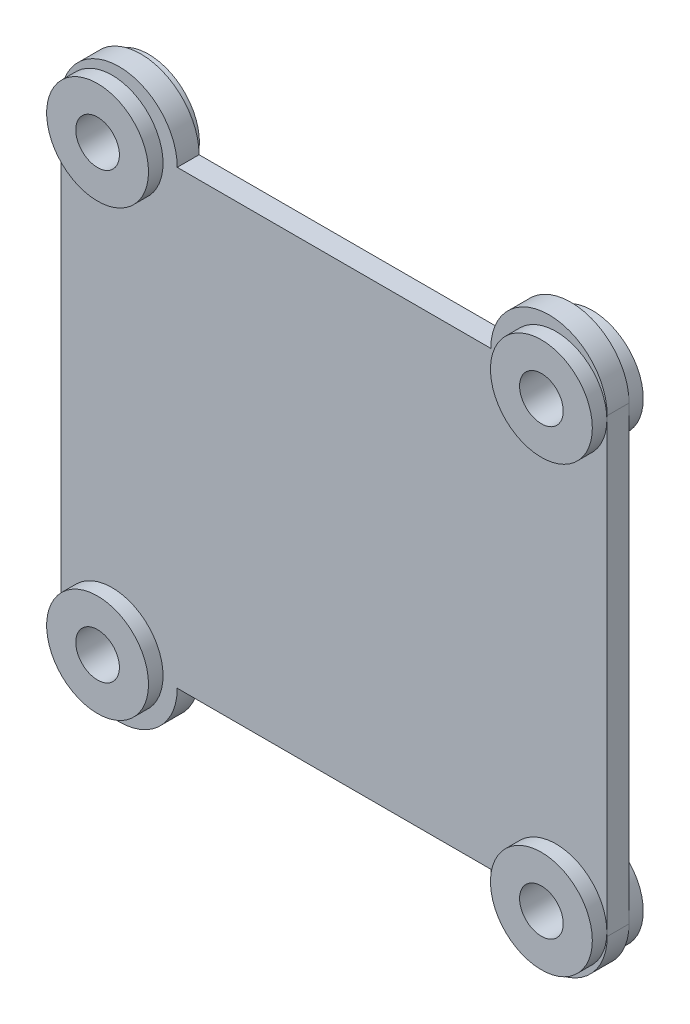
ISO-10303-21;
HEADER;
FILE_DESCRIPTION(('STEP AP214'),'2;1');
FILE_NAME('part.step','',(''),(''),'','','');
FILE_SCHEMA(('AUTOMOTIVE_DESIGN { 1 0 10303 214 1 1 1 1 }'));
ENDSEC;
DATA;
#1=APPLICATION_CONTEXT('core data for automotive mechanical design processes');
#2=APPLICATION_PROTOCOL_DEFINITION('international standard','automotive_design',2000,#1);
#3=PRODUCT_CONTEXT('',#1,'mechanical');
#4=PRODUCT('Part','Part','',(#3));
#5=PRODUCT_RELATED_PRODUCT_CATEGORY('part','',(#4));
#6=PRODUCT_DEFINITION_FORMATION('','',#4);
#7=PRODUCT_DEFINITION_CONTEXT('part definition',#1,'design');
#8=PRODUCT_DEFINITION('design','',#6,#7);
#9=PRODUCT_DEFINITION_SHAPE('','',#8);
#10=(LENGTH_UNIT() NAMED_UNIT(*) SI_UNIT(.MILLI.,.METRE.));
#11=(NAMED_UNIT(*) PLANE_ANGLE_UNIT() SI_UNIT($,.RADIAN.));
#12=(NAMED_UNIT(*) SI_UNIT($,.STERADIAN.) SOLID_ANGLE_UNIT());
#13=UNCERTAINTY_MEASURE_WITH_UNIT(LENGTH_MEASURE(1.E-05),#10,'distance_accuracy_value','');
#14=(GEOMETRIC_REPRESENTATION_CONTEXT(3) GLOBAL_UNCERTAINTY_ASSIGNED_CONTEXT((#13)) GLOBAL_UNIT_ASSIGNED_CONTEXT((#10,
#11,#12)) REPRESENTATION_CONTEXT('',''));
#15=CARTESIAN_POINT('',(0.,0.,0.));
#16=DIRECTION('',(0.,0.,1.));
#17=DIRECTION('',(1.,0.,0.));
#18=AXIS2_PLACEMENT_3D('',#15,#16,#17);
#19=CARTESIAN_POINT('',(13.8832261201287,-17.3040229885057,1.5));
#20=DIRECTION('',(0.,0.,-1.));
#21=DIRECTION('',(-1.,0.,0.));
#22=AXIS2_PLACEMENT_3D('',#19,#20,#21);
#23=PLANE('',#22);
#24=CARTESIAN_POINT('',(14.358226120129,13.4459770114943,1.5));
#25=DIRECTION('',(0.,0.,1.));
#26=DIRECTION('',(1.,0.,0.));
#27=AXIS2_PLACEMENT_3D('',#24,#25,#26);
#28=CIRCLE('',#27,3.5);
#29=CARTESIAN_POINT('',(17.858226120129,13.4459770114943,1.5));
#30=VERTEX_POINT('',#29);
#31=EDGE_CURVE('E283',#30,#30,#28,.T.);
#32=ORIENTED_EDGE('',*,*,#31,.F.);
#33=EDGE_LOOP('',(#32));
#34=FACE_BOUND('',#33,.T.);
#35=CARTESIAN_POINT('',(14.358226120129,-17.0540229885057,1.5));
#36=DIRECTION('',(0.,0.,1.));
#37=DIRECTION('',(1.,0.,0.));
#38=AXIS2_PLACEMENT_3D('',#35,#36,#37);
#39=CIRCLE('',#38,3.5);
#40=CARTESIAN_POINT('',(17.858226120129,-17.0540229885057,1.5));
#41=VERTEX_POINT('',#40);
#42=EDGE_CURVE('E299',#41,#41,#39,.T.);
#43=ORIENTED_EDGE('',*,*,#42,.F.);
#44=EDGE_LOOP('',(#43));
#45=FACE_BOUND('',#44,.T.);
#46=CARTESIAN_POINT('',(-16.141773879871,13.4459770114942,1.5));
#47=DIRECTION('',(0.,0.,1.));
#48=DIRECTION('',(1.,0.,0.));
#49=AXIS2_PLACEMENT_3D('',#46,#47,#48);
#50=CIRCLE('',#49,3.5);
#51=CARTESIAN_POINT('',(-12.641773879871,13.4459770114942,1.5));
#52=VERTEX_POINT('',#51);
#53=EDGE_CURVE('E314',#52,#52,#50,.T.);
#54=ORIENTED_EDGE('',*,*,#53,.F.);
#55=EDGE_LOOP('',(#54));
#56=FACE_BOUND('',#55,.T.);
#57=CARTESIAN_POINT('',(-16.141773879871,-17.0540229885057,1.5));
#58=DIRECTION('',(0.,0.,1.));
#59=DIRECTION('',(1.,0.,0.));
#60=AXIS2_PLACEMENT_3D('',#57,#58,#59);
#61=CIRCLE('',#60,3.5);
#62=CARTESIAN_POINT('',(-12.641773879871,-17.0540229885057,1.5));
#63=VERTEX_POINT('',#62);
#64=EDGE_CURVE('E329',#63,#63,#61,.T.);
#65=ORIENTED_EDGE('',*,*,#64,.F.);
#66=EDGE_LOOP('',(#65));
#67=FACE_BOUND('',#66,.T.);
#68=CARTESIAN_POINT('',(13.8832261201287,-17.3040229885057,1.5));
#69=DIRECTION('',(0.,0.,1.));
#70=DIRECTION('',(-1.,0.,0.));
#71=AXIS2_PLACEMENT_3D('',#68,#69,#70);
#72=CIRCLE('',#71,4.);
#73=CARTESIAN_POINT('',(9.88322612012868,-17.3040229885057,1.5));
#74=VERTEX_POINT('',#73);
#75=CARTESIAN_POINT('',(17.8832261201287,-17.3040229885057,1.5));
#76=VERTEX_POINT('',#75);
#77=EDGE_CURVE('E147',#74,#76,#72,.T.);
#78=ORIENTED_EDGE('',*,*,#77,.T.);
#79=DIRECTION('',(0.,1.,0.));
#80=VECTOR('',#79,1.);
#81=CARTESIAN_POINT('',(17.8832261201287,13.6959770114942,1.5));
#82=LINE('',#81,#80);
#83=CARTESIAN_POINT('',(17.8832261201287,13.6959770114942,1.5));
#84=VERTEX_POINT('',#83);
#85=EDGE_CURVE('E96',#76,#84,#82,.T.);
#86=ORIENTED_EDGE('',*,*,#85,.T.);
#87=CARTESIAN_POINT('',(13.8832261201287,13.6959770114942,1.5));
#88=DIRECTION('',(0.,0.,1.));
#89=DIRECTION('',(1.,0.,0.));
#90=AXIS2_PLACEMENT_3D('',#87,#88,#89);
#91=CIRCLE('',#90,4.);
#92=CARTESIAN_POINT('',(9.88322612012868,13.6959770114942,1.5));
#93=VERTEX_POINT('',#92);
#94=EDGE_CURVE('E345',#84,#93,#91,.T.);
#95=ORIENTED_EDGE('',*,*,#94,.T.);
#96=DIRECTION('',(-1.,0.,0.));
#97=VECTOR('',#96,1.);
#98=CARTESIAN_POINT('',(-11.6667738798713,13.6959770114942,1.5));
#99=LINE('',#98,#97);
#100=CARTESIAN_POINT('',(-11.6667738798713,13.6959770114942,1.5));
#101=VERTEX_POINT('',#100);
#102=EDGE_CURVE('E347',#93,#101,#99,.T.);
#103=ORIENTED_EDGE('',*,*,#102,.T.);
#104=CARTESIAN_POINT('',(-15.6667738798713,13.6959770114942,1.5));
#105=DIRECTION('',(0.,0.,1.));
#106=DIRECTION('',(1.,0.,0.));
#107=AXIS2_PLACEMENT_3D('',#104,#105,#106);
#108=CIRCLE('',#107,4.);
#109=CARTESIAN_POINT('',(-19.6667738798713,13.6959770114942,1.5));
#110=VERTEX_POINT('',#109);
#111=EDGE_CURVE('E114',#101,#110,#108,.T.);
#112=ORIENTED_EDGE('',*,*,#111,.T.);
#113=DIRECTION('',(0.,-1.,0.));
#114=VECTOR('',#113,1.);
#115=CARTESIAN_POINT('',(-19.6667738798713,13.6959770114942,1.5));
#116=LINE('',#115,#114);
#117=CARTESIAN_POINT('',(-19.6667738798713,-17.3040229885057,1.5));
#118=VERTEX_POINT('',#117);
#119=EDGE_CURVE('E109',#110,#118,#116,.T.);
#120=ORIENTED_EDGE('',*,*,#119,.T.);
#121=CARTESIAN_POINT('',(-15.6667738798713,-17.3040229885057,1.5));
#122=DIRECTION('',(0.,0.,1.));
#123=DIRECTION('',(-1.,0.,0.));
#124=AXIS2_PLACEMENT_3D('',#121,#122,#123);
#125=CIRCLE('',#124,4.);
#126=CARTESIAN_POINT('',(-11.6667738798713,-17.3040229885057,1.5));
#127=VERTEX_POINT('',#126);
#128=EDGE_CURVE('E112',#118,#127,#125,.T.);
#129=ORIENTED_EDGE('',*,*,#128,.T.);
#130=DIRECTION('',(1.,0.,0.));
#131=VECTOR('',#130,1.);
#132=CARTESIAN_POINT('',(-11.6667738798713,-17.3040229885057,1.5));
#133=LINE('',#132,#131);
#134=EDGE_CURVE('E52',#127,#74,#133,.T.);
#135=ORIENTED_EDGE('',*,*,#134,.T.);
#136=EDGE_LOOP('',(#78,#86,#95,#103,#112,#120,#129,#135));
#137=FACE_BOUND('',#136,.T.);
#138=ADVANCED_FACE('F35',(#34,#45,#56,#67,#137),#23,.F.);
#139=CARTESIAN_POINT('',(13.8832261201287,-17.3040229885057,0.));
#140=DIRECTION('',(0.,0.,-1.));
#141=DIRECTION('',(-1.,0.,0.));
#142=AXIS2_PLACEMENT_3D('',#139,#140,#141);
#143=PLANE('',#142);
#144=CARTESIAN_POINT('',(14.358226120129,13.4459770114943,0.));
#145=DIRECTION('',(0.,0.,-1.));
#146=DIRECTION('',(-1.,0.,0.));
#147=AXIS2_PLACEMENT_3D('',#144,#145,#146);
#148=CIRCLE('',#147,3.5);
#149=CARTESIAN_POINT('',(10.858226120129,13.4459770114943,0.));
#150=VERTEX_POINT('',#149);
#151=EDGE_CURVE('E11',#150,#150,#148,.T.);
#152=ORIENTED_EDGE('',*,*,#151,.F.);
#153=EDGE_LOOP('',(#152));
#154=FACE_BOUND('',#153,.T.);
#155=CARTESIAN_POINT('',(14.358226120129,-17.0540229885057,0.));
#156=DIRECTION('',(0.,0.,-1.));
#157=DIRECTION('',(-1.,0.,0.));
#158=AXIS2_PLACEMENT_3D('',#155,#156,#157);
#159=CIRCLE('',#158,3.5);
#160=CARTESIAN_POINT('',(10.858226120129,-17.0540229885057,0.));
#161=VERTEX_POINT('',#160);
#162=EDGE_CURVE('E44',#161,#161,#159,.T.);
#163=ORIENTED_EDGE('',*,*,#162,.F.);
#164=EDGE_LOOP('',(#163));
#165=FACE_BOUND('',#164,.T.);
#166=CARTESIAN_POINT('',(-16.141773879871,13.4459770114942,0.));
#167=DIRECTION('',(0.,0.,-1.));
#168=DIRECTION('',(-1.,0.,0.));
#169=AXIS2_PLACEMENT_3D('',#166,#167,#168);
#170=CIRCLE('',#169,3.5);
#171=CARTESIAN_POINT('',(-19.641773879871,13.4459770114942,0.));
#172=VERTEX_POINT('',#171);
#173=EDGE_CURVE('E165',#172,#172,#170,.T.);
#174=ORIENTED_EDGE('',*,*,#173,.F.);
#175=EDGE_LOOP('',(#174));
#176=FACE_BOUND('',#175,.T.);
#177=CARTESIAN_POINT('',(-16.141773879871,-17.0540229885057,0.));
#178=DIRECTION('',(0.,0.,-1.));
#179=DIRECTION('',(-1.,0.,0.));
#180=AXIS2_PLACEMENT_3D('',#177,#178,#179);
#181=CIRCLE('',#180,3.5);
#182=CARTESIAN_POINT('',(-19.641773879871,-17.0540229885057,0.));
#183=VERTEX_POINT('',#182);
#184=EDGE_CURVE('E162',#183,#183,#181,.T.);
#185=ORIENTED_EDGE('',*,*,#184,.F.);
#186=EDGE_LOOP('',(#185));
#187=FACE_BOUND('',#186,.T.);
#188=CARTESIAN_POINT('',(13.8832261201287,-17.3040229885057,0.));
#189=DIRECTION('',(0.,0.,1.));
#190=DIRECTION('',(-1.,0.,0.));
#191=AXIS2_PLACEMENT_3D('',#188,#189,#190);
#192=CIRCLE('',#191,4.);
#193=CARTESIAN_POINT('',(9.88322612012868,-17.3040229885057,0.));
#194=VERTEX_POINT('',#193);
#195=CARTESIAN_POINT('',(17.8832261201287,-17.3040229885057,0.));
#196=VERTEX_POINT('',#195);
#197=EDGE_CURVE('E132',#194,#196,#192,.T.);
#198=ORIENTED_EDGE('',*,*,#197,.F.);
#199=DIRECTION('',(1.,0.,0.));
#200=VECTOR('',#199,1.);
#201=CARTESIAN_POINT('',(-11.6667738798713,-17.3040229885057,0.));
#202=LINE('',#201,#200);
#203=CARTESIAN_POINT('',(-11.6667738798713,-17.3040229885057,0.));
#204=VERTEX_POINT('',#203);
#205=EDGE_CURVE('E87',#204,#194,#202,.T.);
#206=ORIENTED_EDGE('',*,*,#205,.F.);
#207=CARTESIAN_POINT('',(-15.6667738798713,-17.3040229885057,0.));
#208=DIRECTION('',(0.,0.,1.));
#209=DIRECTION('',(-1.,0.,0.));
#210=AXIS2_PLACEMENT_3D('',#207,#208,#209);
#211=CIRCLE('',#210,4.);
#212=CARTESIAN_POINT('',(-19.6667738798713,-17.3040229885057,0.));
#213=VERTEX_POINT('',#212);
#214=EDGE_CURVE('E81',#213,#204,#211,.T.);
#215=ORIENTED_EDGE('',*,*,#214,.F.);
#216=DIRECTION('',(0.,-1.,0.));
#217=VECTOR('',#216,1.);
#218=CARTESIAN_POINT('',(-19.6667738798713,13.6959770114942,0.));
#219=LINE('',#218,#217);
#220=CARTESIAN_POINT('',(-19.6667738798713,13.6959770114942,0.));
#221=VERTEX_POINT('',#220);
#222=EDGE_CURVE('E122',#221,#213,#219,.T.);
#223=ORIENTED_EDGE('',*,*,#222,.F.);
#224=CARTESIAN_POINT('',(-15.6667738798713,13.6959770114942,0.));
#225=DIRECTION('',(0.,0.,1.));
#226=DIRECTION('',(1.,0.,0.));
#227=AXIS2_PLACEMENT_3D('',#224,#225,#226);
#228=CIRCLE('',#227,4.);
#229=CARTESIAN_POINT('',(-11.6667738798713,13.6959770114942,0.));
#230=VERTEX_POINT('',#229);
#231=EDGE_CURVE('E142',#230,#221,#228,.T.);
#232=ORIENTED_EDGE('',*,*,#231,.F.);
#233=DIRECTION('',(-1.,0.,0.));
#234=VECTOR('',#233,1.);
#235=CARTESIAN_POINT('',(-11.6667738798713,13.6959770114942,0.));
#236=LINE('',#235,#234);
#237=CARTESIAN_POINT('',(9.88322612012868,13.6959770114942,0.));
#238=VERTEX_POINT('',#237);
#239=EDGE_CURVE('E140',#238,#230,#236,.T.);
#240=ORIENTED_EDGE('',*,*,#239,.F.);
#241=CARTESIAN_POINT('',(13.8832261201287,13.6959770114942,0.));
#242=DIRECTION('',(0.,0.,1.));
#243=DIRECTION('',(1.,0.,0.));
#244=AXIS2_PLACEMENT_3D('',#241,#242,#243);
#245=CIRCLE('',#244,4.);
#246=CARTESIAN_POINT('',(17.8832261201287,13.6959770114942,0.));
#247=VERTEX_POINT('',#246);
#248=EDGE_CURVE('E138',#247,#238,#245,.T.);
#249=ORIENTED_EDGE('',*,*,#248,.F.);
#250=DIRECTION('',(0.,1.,0.));
#251=VECTOR('',#250,1.);
#252=CARTESIAN_POINT('',(17.8832261201287,13.6959770114942,0.));
#253=LINE('',#252,#251);
#254=EDGE_CURVE('E135',#196,#247,#253,.T.);
#255=ORIENTED_EDGE('',*,*,#254,.F.);
#256=EDGE_LOOP('',(#198,#206,#215,#223,#232,#240,#249,#255));
#257=FACE_BOUND('',#256,.T.);
#258=ADVANCED_FACE('F172',(#154,#165,#176,#187,#257),#143,.T.);
#259=CARTESIAN_POINT('',(13.8832261201287,-17.3040229885057,1.5));
#260=DIRECTION('',(0.,0.,-1.));
#261=DIRECTION('',(-1.,0.,0.));
#262=AXIS2_PLACEMENT_3D('',#259,#260,#261);
#263=CYLINDRICAL_SURFACE('',#262,4.);
#264=ORIENTED_EDGE('',*,*,#197,.T.);
#265=DIRECTION('',(0.,0.,-1.));
#266=VECTOR('',#265,1.);
#267=CARTESIAN_POINT('',(17.8832261201287,-17.3040229885057,1.5));
#268=LINE('',#267,#266);
#269=EDGE_CURVE('E160',#76,#196,#268,.T.);
#270=ORIENTED_EDGE('',*,*,#269,.F.);
#271=ORIENTED_EDGE('',*,*,#77,.F.);
#272=DIRECTION('',(0.,0.,-1.));
#273=VECTOR('',#272,1.);
#274=CARTESIAN_POINT('',(9.88322612012868,-17.3040229885057,1.5));
#275=LINE('',#274,#273);
#276=EDGE_CURVE('E128',#74,#194,#275,.T.);
#277=ORIENTED_EDGE('',*,*,#276,.T.);
#278=EDGE_LOOP('',(#264,#270,#271,#277));
#279=FACE_BOUND('',#278,.T.);
#280=ADVANCED_FACE('F37',(#279),#263,.T.);
#281=CARTESIAN_POINT('',(17.8832261201287,13.6959770114942,1.5));
#282=DIRECTION('',(-1.,0.,0.));
#283=DIRECTION('',(0.,0.,1.));
#284=AXIS2_PLACEMENT_3D('',#281,#282,#283);
#285=PLANE('',#284);
#286=ORIENTED_EDGE('',*,*,#254,.T.);
#287=DIRECTION('',(0.,0.,-1.));
#288=VECTOR('',#287,1.);
#289=CARTESIAN_POINT('',(17.8832261201287,13.6959770114942,1.5));
#290=LINE('',#289,#288);
#291=EDGE_CURVE('E157',#84,#247,#290,.T.);
#292=ORIENTED_EDGE('',*,*,#291,.F.);
#293=ORIENTED_EDGE('',*,*,#85,.F.);
#294=ORIENTED_EDGE('',*,*,#269,.T.);
#295=EDGE_LOOP('',(#286,#292,#293,#294));
#296=FACE_BOUND('',#295,.T.);
#297=ADVANCED_FACE('F360',(#296),#285,.F.);
#298=CARTESIAN_POINT('',(13.8832261201287,13.6959770114942,1.5));
#299=DIRECTION('',(0.,0.,-1.));
#300=DIRECTION('',(-1.,0.,0.));
#301=AXIS2_PLACEMENT_3D('',#298,#299,#300);
#302=CYLINDRICAL_SURFACE('',#301,4.);
#303=ORIENTED_EDGE('',*,*,#248,.T.);
#304=DIRECTION('',(0.,0.,-1.));
#305=VECTOR('',#304,1.);
#306=CARTESIAN_POINT('',(9.88322612012868,13.6959770114942,1.5));
#307=LINE('',#306,#305);
#308=EDGE_CURVE('E154',#93,#238,#307,.T.);
#309=ORIENTED_EDGE('',*,*,#308,.F.);
#310=ORIENTED_EDGE('',*,*,#94,.F.);
#311=ORIENTED_EDGE('',*,*,#291,.T.);
#312=EDGE_LOOP('',(#303,#309,#310,#311));
#313=FACE_BOUND('',#312,.T.);
#314=ADVANCED_FACE('F359',(#313),#302,.T.);
#315=CARTESIAN_POINT('',(-11.6667738798713,13.6959770114942,1.5));
#316=DIRECTION('',(0.,-1.,0.));
#317=DIRECTION('',(0.,0.,-1.));
#318=AXIS2_PLACEMENT_3D('',#315,#316,#317);
#319=PLANE('',#318);
#320=ORIENTED_EDGE('',*,*,#239,.T.);
#321=DIRECTION('',(0.,0.,-1.));
#322=VECTOR('',#321,1.);
#323=CARTESIAN_POINT('',(-11.6667738798713,13.6959770114942,1.5));
#324=LINE('',#323,#322);
#325=EDGE_CURVE('E151',#101,#230,#324,.T.);
#326=ORIENTED_EDGE('',*,*,#325,.F.);
#327=ORIENTED_EDGE('',*,*,#102,.F.);
#328=ORIENTED_EDGE('',*,*,#308,.T.);
#329=EDGE_LOOP('',(#320,#326,#327,#328));
#330=FACE_BOUND('',#329,.T.);
#331=ADVANCED_FACE('F353',(#330),#319,.F.);
#332=CARTESIAN_POINT('',(-15.6667738798713,13.6959770114942,1.5));
#333=DIRECTION('',(0.,0.,-1.));
#334=DIRECTION('',(-1.,0.,0.));
#335=AXIS2_PLACEMENT_3D('',#332,#333,#334);
#336=CYLINDRICAL_SURFACE('',#335,4.);
#337=ORIENTED_EDGE('',*,*,#231,.T.);
#338=DIRECTION('',(0.,0.,-1.));
#339=VECTOR('',#338,1.);
#340=CARTESIAN_POINT('',(-19.6667738798713,13.6959770114942,1.5));
#341=LINE('',#340,#339);
#342=EDGE_CURVE('E123',#110,#221,#341,.T.);
#343=ORIENTED_EDGE('',*,*,#342,.F.);
#344=ORIENTED_EDGE('',*,*,#111,.F.);
#345=ORIENTED_EDGE('',*,*,#325,.T.);
#346=EDGE_LOOP('',(#337,#343,#344,#345));
#347=FACE_BOUND('',#346,.T.);
#348=ADVANCED_FACE('F357',(#347),#336,.T.);
#349=CARTESIAN_POINT('',(-19.6667738798713,13.6959770114942,1.5));
#350=DIRECTION('',(1.,0.,0.));
#351=DIRECTION('',(0.,1.,0.));
#352=AXIS2_PLACEMENT_3D('',#349,#350,#351);
#353=PLANE('',#352);
#354=ORIENTED_EDGE('',*,*,#222,.T.);
#355=DIRECTION('',(0.,0.,-1.));
#356=VECTOR('',#355,1.);
#357=CARTESIAN_POINT('',(-19.6667738798713,-17.3040229885057,1.5));
#358=LINE('',#357,#356);
#359=EDGE_CURVE('E119',#118,#213,#358,.T.);
#360=ORIENTED_EDGE('',*,*,#359,.F.);
#361=ORIENTED_EDGE('',*,*,#119,.F.);
#362=ORIENTED_EDGE('',*,*,#342,.T.);
#363=EDGE_LOOP('',(#354,#360,#361,#362));
#364=FACE_BOUND('',#363,.T.);
#365=ADVANCED_FACE('F120',(#364),#353,.F.);
#366=CARTESIAN_POINT('',(-15.6667738798713,-17.3040229885057,1.5));
#367=DIRECTION('',(0.,0.,-1.));
#368=DIRECTION('',(-1.,0.,0.));
#369=AXIS2_PLACEMENT_3D('',#366,#367,#368);
#370=CYLINDRICAL_SURFACE('',#369,4.);
#371=ORIENTED_EDGE('',*,*,#214,.T.);
#372=DIRECTION('',(0.,0.,-1.));
#373=VECTOR('',#372,1.);
#374=CARTESIAN_POINT('',(-11.6667738798713,-17.3040229885057,1.5));
#375=LINE('',#374,#373);
#376=EDGE_CURVE('E124',#127,#204,#375,.T.);
#377=ORIENTED_EDGE('',*,*,#376,.F.);
#378=ORIENTED_EDGE('',*,*,#128,.F.);
#379=ORIENTED_EDGE('',*,*,#359,.T.);
#380=EDGE_LOOP('',(#371,#377,#378,#379));
#381=FACE_BOUND('',#380,.T.);
#382=ADVANCED_FACE('F126',(#381),#370,.T.);
#383=CARTESIAN_POINT('',(-11.6667738798713,-17.3040229885057,1.5));
#384=DIRECTION('',(0.,1.,0.));
#385=DIRECTION('',(-1.,0.,0.));
#386=AXIS2_PLACEMENT_3D('',#383,#384,#385);
#387=PLANE('',#386);
#388=ORIENTED_EDGE('',*,*,#205,.T.);
#389=ORIENTED_EDGE('',*,*,#276,.F.);
#390=ORIENTED_EDGE('',*,*,#134,.F.);
#391=ORIENTED_EDGE('',*,*,#376,.T.);
#392=EDGE_LOOP('',(#388,#389,#390,#391));
#393=FACE_BOUND('',#392,.T.);
#394=ADVANCED_FACE('F186',(#393),#387,.F.);
#395=CARTESIAN_POINT('',(-16.141773879871,-17.0540229885057,2.5));
#396=DIRECTION('',(0.,0.,1.));
#397=DIRECTION('',(1.,0.,0.));
#398=AXIS2_PLACEMENT_3D('',#395,#396,#397);
#399=CYLINDRICAL_SURFACE('',#398,3.5);
#400=CARTESIAN_POINT('',(-16.141773879871,-17.0540229885057,-1.));
#401=DIRECTION('',(0.,0.,1.));
#402=DIRECTION('',(1.,0.,0.));
#403=AXIS2_PLACEMENT_3D('',#400,#401,#402);
#404=CIRCLE('',#403,3.5);
#405=CARTESIAN_POINT('',(-12.641773879871,-17.0540229885057,-1.));
#406=VERTEX_POINT('',#405);
#407=EDGE_CURVE('E136',#406,#406,#404,.T.);
#408=ORIENTED_EDGE('',*,*,#407,.T.);
#409=EDGE_LOOP('',(#408));
#410=FACE_BOUND('',#409,.T.);
#411=ORIENTED_EDGE('',*,*,#184,.T.);
#412=EDGE_LOOP('',(#411));
#413=FACE_BOUND('',#412,.T.);
#414=ADVANCED_FACE('F188',(#410,#413),#399,.T.);
#415=CARTESIAN_POINT('',(-17.641773879871,-17.0540229885058,-1.));
#416=DIRECTION('',(0.,0.,-1.));
#417=DIRECTION('',(-1.,0.,0.));
#418=AXIS2_PLACEMENT_3D('',#415,#416,#417);
#419=PLANE('',#418);
#420=CARTESIAN_POINT('',(-16.141773879871,-17.0540229885057,-1.));
#421=DIRECTION('',(0.,0.,1.));
#422=DIRECTION('',(1.,0.,0.));
#423=AXIS2_PLACEMENT_3D('',#420,#421,#422);
#424=CIRCLE('',#423,1.5);
#425=CARTESIAN_POINT('',(-14.641773879871,-17.0540229885057,-1.));
#426=VERTEX_POINT('',#425);
#427=EDGE_CURVE('E338',#426,#426,#424,.T.);
#428=ORIENTED_EDGE('',*,*,#427,.T.);
#429=EDGE_LOOP('',(#428));
#430=FACE_BOUND('',#429,.T.);
#431=ORIENTED_EDGE('',*,*,#407,.F.);
#432=EDGE_LOOP('',(#431));
#433=FACE_BOUND('',#432,.T.);
#434=ADVANCED_FACE('F194',(#430,#433),#419,.T.);
#435=CARTESIAN_POINT('',(-16.141773879871,-17.0540229885057,2.5));
#436=DIRECTION('',(0.,0.,1.));
#437=DIRECTION('',(1.,0.,0.));
#438=AXIS2_PLACEMENT_3D('',#435,#436,#437);
#439=CYLINDRICAL_SURFACE('',#438,1.5);
#440=CARTESIAN_POINT('',(-16.141773879871,-17.0540229885057,2.5));
#441=DIRECTION('',(0.,0.,1.));
#442=DIRECTION('',(1.,0.,0.));
#443=AXIS2_PLACEMENT_3D('',#440,#441,#442);
#444=CIRCLE('',#443,1.5);
#445=CARTESIAN_POINT('',(-14.641773879871,-17.0540229885057,2.5));
#446=VERTEX_POINT('',#445);
#447=EDGE_CURVE('E335',#446,#446,#444,.T.);
#448=ORIENTED_EDGE('',*,*,#447,.T.);
#449=EDGE_LOOP('',(#448));
#450=FACE_BOUND('',#449,.T.);
#451=ORIENTED_EDGE('',*,*,#427,.F.);
#452=EDGE_LOOP('',(#451));
#453=FACE_BOUND('',#452,.T.);
#454=ADVANCED_FACE('F208',(#450,#453),#439,.F.);
#455=CARTESIAN_POINT('',(-19.641773879871,-17.0540229885058,2.5));
#456=DIRECTION('',(0.,0.,1.));
#457=DIRECTION('',(1.,0.,0.));
#458=AXIS2_PLACEMENT_3D('',#455,#456,#457);
#459=PLANE('',#458);
#460=CARTESIAN_POINT('',(-16.141773879871,-17.0540229885057,2.5));
#461=DIRECTION('',(0.,0.,1.));
#462=DIRECTION('',(1.,0.,0.));
#463=AXIS2_PLACEMENT_3D('',#460,#461,#462);
#464=CIRCLE('',#463,3.5);
#465=CARTESIAN_POINT('',(-12.641773879871,-17.0540229885057,2.5));
#466=VERTEX_POINT('',#465);
#467=EDGE_CURVE('E332',#466,#466,#464,.T.);
#468=ORIENTED_EDGE('',*,*,#467,.T.);
#469=EDGE_LOOP('',(#468));
#470=FACE_BOUND('',#469,.T.);
#471=ORIENTED_EDGE('',*,*,#447,.F.);
#472=EDGE_LOOP('',(#471));
#473=FACE_BOUND('',#472,.T.);
#474=ADVANCED_FACE('F212',(#470,#473),#459,.T.);
#475=CARTESIAN_POINT('',(-16.141773879871,-17.0540229885057,2.5));
#476=DIRECTION('',(0.,0.,1.));
#477=DIRECTION('',(1.,0.,0.));
#478=AXIS2_PLACEMENT_3D('',#475,#476,#477);
#479=CYLINDRICAL_SURFACE('',#478,3.5);
#480=ORIENTED_EDGE('',*,*,#64,.T.);
#481=EDGE_LOOP('',(#480));
#482=FACE_BOUND('',#481,.T.);
#483=ORIENTED_EDGE('',*,*,#467,.F.);
#484=EDGE_LOOP('',(#483));
#485=FACE_BOUND('',#484,.T.);
#486=ADVANCED_FACE('F216',(#482,#485),#479,.T.);
#487=CARTESIAN_POINT('',(-16.141773879871,13.4459770114942,2.5));
#488=DIRECTION('',(0.,0.,1.));
#489=DIRECTION('',(1.,0.,0.));
#490=AXIS2_PLACEMENT_3D('',#487,#488,#489);
#491=CYLINDRICAL_SURFACE('',#490,3.5);
#492=CARTESIAN_POINT('',(-16.141773879871,13.4459770114942,-1.));
#493=DIRECTION('',(0.,0.,1.));
#494=DIRECTION('',(1.,0.,0.));
#495=AXIS2_PLACEMENT_3D('',#492,#493,#494);
#496=CIRCLE('',#495,3.5);
#497=CARTESIAN_POINT('',(-12.641773879871,13.4459770114942,-1.));
#498=VERTEX_POINT('',#497);
#499=EDGE_CURVE('E326',#498,#498,#496,.T.);
#500=ORIENTED_EDGE('',*,*,#499,.T.);
#501=EDGE_LOOP('',(#500));
#502=FACE_BOUND('',#501,.T.);
#503=ORIENTED_EDGE('',*,*,#173,.T.);
#504=EDGE_LOOP('',(#503));
#505=FACE_BOUND('',#504,.T.);
#506=ADVANCED_FACE('F220',(#502,#505),#491,.T.);
#507=CARTESIAN_POINT('',(-17.641773879871,13.4459770114942,-1.));
#508=DIRECTION('',(0.,0.,-1.));
#509=DIRECTION('',(-1.,0.,0.));
#510=AXIS2_PLACEMENT_3D('',#507,#508,#509);
#511=PLANE('',#510);
#512=CARTESIAN_POINT('',(-16.141773879871,13.4459770114942,-1.));
#513=DIRECTION('',(0.,0.,1.));
#514=DIRECTION('',(1.,0.,0.));
#515=AXIS2_PLACEMENT_3D('',#512,#513,#514);
#516=CIRCLE('',#515,1.5);
#517=CARTESIAN_POINT('',(-14.641773879871,13.4459770114942,-1.));
#518=VERTEX_POINT('',#517);
#519=EDGE_CURVE('E323',#518,#518,#516,.T.);
#520=ORIENTED_EDGE('',*,*,#519,.T.);
#521=EDGE_LOOP('',(#520));
#522=FACE_BOUND('',#521,.T.);
#523=ORIENTED_EDGE('',*,*,#499,.F.);
#524=EDGE_LOOP('',(#523));
#525=FACE_BOUND('',#524,.T.);
#526=ADVANCED_FACE('F224',(#522,#525),#511,.T.);
#527=CARTESIAN_POINT('',(-16.141773879871,13.4459770114942,2.5));
#528=DIRECTION('',(0.,0.,1.));
#529=DIRECTION('',(1.,0.,0.));
#530=AXIS2_PLACEMENT_3D('',#527,#528,#529);
#531=CYLINDRICAL_SURFACE('',#530,1.5);
#532=CARTESIAN_POINT('',(-16.141773879871,13.4459770114942,2.5));
#533=DIRECTION('',(0.,0.,1.));
#534=DIRECTION('',(1.,0.,0.));
#535=AXIS2_PLACEMENT_3D('',#532,#533,#534);
#536=CIRCLE('',#535,1.5);
#537=CARTESIAN_POINT('',(-14.641773879871,13.4459770114942,2.5));
#538=VERTEX_POINT('',#537);
#539=EDGE_CURVE('E320',#538,#538,#536,.T.);
#540=ORIENTED_EDGE('',*,*,#539,.T.);
#541=EDGE_LOOP('',(#540));
#542=FACE_BOUND('',#541,.T.);
#543=ORIENTED_EDGE('',*,*,#519,.F.);
#544=EDGE_LOOP('',(#543));
#545=FACE_BOUND('',#544,.T.);
#546=ADVANCED_FACE('F228',(#542,#545),#531,.F.);
#547=CARTESIAN_POINT('',(-19.641773879871,13.4459770114942,2.5));
#548=DIRECTION('',(0.,0.,1.));
#549=DIRECTION('',(1.,0.,0.));
#550=AXIS2_PLACEMENT_3D('',#547,#548,#549);
#551=PLANE('',#550);
#552=CARTESIAN_POINT('',(-16.141773879871,13.4459770114942,2.5));
#553=DIRECTION('',(0.,0.,1.));
#554=DIRECTION('',(1.,0.,0.));
#555=AXIS2_PLACEMENT_3D('',#552,#553,#554);
#556=CIRCLE('',#555,3.5);
#557=CARTESIAN_POINT('',(-12.641773879871,13.4459770114942,2.5));
#558=VERTEX_POINT('',#557);
#559=EDGE_CURVE('E317',#558,#558,#556,.T.);
#560=ORIENTED_EDGE('',*,*,#559,.T.);
#561=EDGE_LOOP('',(#560));
#562=FACE_BOUND('',#561,.T.);
#563=ORIENTED_EDGE('',*,*,#539,.F.);
#564=EDGE_LOOP('',(#563));
#565=FACE_BOUND('',#564,.T.);
#566=ADVANCED_FACE('F232',(#562,#565),#551,.T.);
#567=CARTESIAN_POINT('',(-16.141773879871,13.4459770114942,2.5));
#568=DIRECTION('',(0.,0.,1.));
#569=DIRECTION('',(1.,0.,0.));
#570=AXIS2_PLACEMENT_3D('',#567,#568,#569);
#571=CYLINDRICAL_SURFACE('',#570,3.5);
#572=ORIENTED_EDGE('',*,*,#53,.T.);
#573=EDGE_LOOP('',(#572));
#574=FACE_BOUND('',#573,.T.);
#575=ORIENTED_EDGE('',*,*,#559,.F.);
#576=EDGE_LOOP('',(#575));
#577=FACE_BOUND('',#576,.T.);
#578=ADVANCED_FACE('F236',(#574,#577),#571,.T.);
#579=CARTESIAN_POINT('',(14.358226120129,-17.0540229885057,2.5));
#580=DIRECTION('',(0.,0.,1.));
#581=DIRECTION('',(1.,0.,0.));
#582=AXIS2_PLACEMENT_3D('',#579,#580,#581);
#583=CYLINDRICAL_SURFACE('',#582,3.5);
#584=CARTESIAN_POINT('',(14.358226120129,-17.0540229885057,-1.));
#585=DIRECTION('',(0.,0.,1.));
#586=DIRECTION('',(1.,0.,0.));
#587=AXIS2_PLACEMENT_3D('',#584,#585,#586);
#588=CIRCLE('',#587,3.5);
#589=CARTESIAN_POINT('',(17.858226120129,-17.0540229885057,-1.));
#590=VERTEX_POINT('',#589);
#591=EDGE_CURVE('E311',#590,#590,#588,.T.);
#592=ORIENTED_EDGE('',*,*,#591,.T.);
#593=EDGE_LOOP('',(#592));
#594=FACE_BOUND('',#593,.T.);
#595=ORIENTED_EDGE('',*,*,#162,.T.);
#596=EDGE_LOOP('',(#595));
#597=FACE_BOUND('',#596,.T.);
#598=ADVANCED_FACE('F170',(#594,#597),#583,.T.);
#599=CARTESIAN_POINT('',(12.858226120129,-17.0540229885057,-1.));
#600=DIRECTION('',(0.,0.,-1.));
#601=DIRECTION('',(-1.,0.,0.));
#602=AXIS2_PLACEMENT_3D('',#599,#600,#601);
#603=PLANE('',#602);
#604=CARTESIAN_POINT('',(14.358226120129,-17.0540229885057,-1.));
#605=DIRECTION('',(0.,0.,1.));
#606=DIRECTION('',(1.,0.,0.));
#607=AXIS2_PLACEMENT_3D('',#604,#605,#606);
#608=CIRCLE('',#607,1.5);
#609=CARTESIAN_POINT('',(15.858226120129,-17.0540229885057,-1.));
#610=VERTEX_POINT('',#609);
#611=EDGE_CURVE('E308',#610,#610,#608,.T.);
#612=ORIENTED_EDGE('',*,*,#611,.T.);
#613=EDGE_LOOP('',(#612));
#614=FACE_BOUND('',#613,.T.);
#615=ORIENTED_EDGE('',*,*,#591,.F.);
#616=EDGE_LOOP('',(#615));
#617=FACE_BOUND('',#616,.T.);
#618=ADVANCED_FACE('F243',(#614,#617),#603,.T.);
#619=CARTESIAN_POINT('',(14.358226120129,-17.0540229885057,2.5));
#620=DIRECTION('',(0.,0.,1.));
#621=DIRECTION('',(1.,0.,0.));
#622=AXIS2_PLACEMENT_3D('',#619,#620,#621);
#623=CYLINDRICAL_SURFACE('',#622,1.5);
#624=CARTESIAN_POINT('',(14.358226120129,-17.0540229885057,2.5));
#625=DIRECTION('',(0.,0.,1.));
#626=DIRECTION('',(1.,0.,0.));
#627=AXIS2_PLACEMENT_3D('',#624,#625,#626);
#628=CIRCLE('',#627,1.5);
#629=CARTESIAN_POINT('',(15.858226120129,-17.0540229885057,2.5));
#630=VERTEX_POINT('',#629);
#631=EDGE_CURVE('E305',#630,#630,#628,.T.);
#632=ORIENTED_EDGE('',*,*,#631,.T.);
#633=EDGE_LOOP('',(#632));
#634=FACE_BOUND('',#633,.T.);
#635=ORIENTED_EDGE('',*,*,#611,.F.);
#636=EDGE_LOOP('',(#635));
#637=FACE_BOUND('',#636,.T.);
#638=ADVANCED_FACE('F247',(#634,#637),#623,.F.);
#639=CARTESIAN_POINT('',(10.858226120129,-17.0540229885057,2.5));
#640=DIRECTION('',(0.,0.,1.));
#641=DIRECTION('',(1.,0.,0.));
#642=AXIS2_PLACEMENT_3D('',#639,#640,#641);
#643=PLANE('',#642);
#644=CARTESIAN_POINT('',(14.358226120129,-17.0540229885057,2.5));
#645=DIRECTION('',(0.,0.,1.));
#646=DIRECTION('',(1.,0.,0.));
#647=AXIS2_PLACEMENT_3D('',#644,#645,#646);
#648=CIRCLE('',#647,3.5);
#649=CARTESIAN_POINT('',(17.858226120129,-17.0540229885057,2.5));
#650=VERTEX_POINT('',#649);
#651=EDGE_CURVE('E302',#650,#650,#648,.T.);
#652=ORIENTED_EDGE('',*,*,#651,.T.);
#653=EDGE_LOOP('',(#652));
#654=FACE_BOUND('',#653,.T.);
#655=ORIENTED_EDGE('',*,*,#631,.F.);
#656=EDGE_LOOP('',(#655));
#657=FACE_BOUND('',#656,.T.);
#658=ADVANCED_FACE('F251',(#654,#657),#643,.T.);
#659=CARTESIAN_POINT('',(14.358226120129,-17.0540229885057,2.5));
#660=DIRECTION('',(0.,0.,1.));
#661=DIRECTION('',(1.,0.,0.));
#662=AXIS2_PLACEMENT_3D('',#659,#660,#661);
#663=CYLINDRICAL_SURFACE('',#662,3.5);
#664=ORIENTED_EDGE('',*,*,#42,.T.);
#665=EDGE_LOOP('',(#664));
#666=FACE_BOUND('',#665,.T.);
#667=ORIENTED_EDGE('',*,*,#651,.F.);
#668=EDGE_LOOP('',(#667));
#669=FACE_BOUND('',#668,.T.);
#670=ADVANCED_FACE('F255',(#666,#669),#663,.T.);
#671=CARTESIAN_POINT('',(14.358226120129,13.4459770114943,2.5));
#672=DIRECTION('',(0.,0.,1.));
#673=DIRECTION('',(1.,0.,0.));
#674=AXIS2_PLACEMENT_3D('',#671,#672,#673);
#675=CYLINDRICAL_SURFACE('',#674,3.5);
#676=CARTESIAN_POINT('',(14.358226120129,13.4459770114943,-1.));
#677=DIRECTION('',(0.,0.,1.));
#678=DIRECTION('',(1.,0.,0.));
#679=AXIS2_PLACEMENT_3D('',#676,#677,#678);
#680=CIRCLE('',#679,3.5);
#681=CARTESIAN_POINT('',(17.858226120129,13.4459770114943,-1.));
#682=VERTEX_POINT('',#681);
#683=EDGE_CURVE('E296',#682,#682,#680,.T.);
#684=ORIENTED_EDGE('',*,*,#683,.T.);
#685=EDGE_LOOP('',(#684));
#686=FACE_BOUND('',#685,.T.);
#687=ORIENTED_EDGE('',*,*,#151,.T.);
#688=EDGE_LOOP('',(#687));
#689=FACE_BOUND('',#688,.T.);
#690=ADVANCED_FACE('F259',(#686,#689),#675,.T.);
#691=CARTESIAN_POINT('',(12.858226120129,13.4459770114943,-1.));
#692=DIRECTION('',(0.,0.,-1.));
#693=DIRECTION('',(-1.,0.,0.));
#694=AXIS2_PLACEMENT_3D('',#691,#692,#693);
#695=PLANE('',#694);
#696=CARTESIAN_POINT('',(14.358226120129,13.4459770114943,-1.));
#697=DIRECTION('',(0.,0.,1.));
#698=DIRECTION('',(1.,0.,0.));
#699=AXIS2_PLACEMENT_3D('',#696,#697,#698);
#700=CIRCLE('',#699,1.5);
#701=CARTESIAN_POINT('',(15.858226120129,13.4459770114943,-1.));
#702=VERTEX_POINT('',#701);
#703=EDGE_CURVE('E290',#702,#702,#700,.T.);
#704=ORIENTED_EDGE('',*,*,#703,.T.);
#705=EDGE_LOOP('',(#704));
#706=FACE_BOUND('',#705,.T.);
#707=ORIENTED_EDGE('',*,*,#683,.F.);
#708=EDGE_LOOP('',(#707));
#709=FACE_BOUND('',#708,.T.);
#710=ADVANCED_FACE('F263',(#706,#709),#695,.T.);
#711=CARTESIAN_POINT('',(14.358226120129,13.4459770114943,2.5));
#712=DIRECTION('',(0.,0.,1.));
#713=DIRECTION('',(1.,0.,0.));
#714=AXIS2_PLACEMENT_3D('',#711,#712,#713);
#715=CYLINDRICAL_SURFACE('',#714,1.5);
#716=CARTESIAN_POINT('',(14.358226120129,13.4459770114943,2.5));
#717=DIRECTION('',(0.,0.,1.));
#718=DIRECTION('',(1.,0.,0.));
#719=AXIS2_PLACEMENT_3D('',#716,#717,#718);
#720=CIRCLE('',#719,1.5);
#721=CARTESIAN_POINT('',(15.858226120129,13.4459770114943,2.5));
#722=VERTEX_POINT('',#721);
#723=EDGE_CURVE('E287',#722,#722,#720,.T.);
#724=ORIENTED_EDGE('',*,*,#723,.T.);
#725=EDGE_LOOP('',(#724));
#726=FACE_BOUND('',#725,.T.);
#727=ORIENTED_EDGE('',*,*,#703,.F.);
#728=EDGE_LOOP('',(#727));
#729=FACE_BOUND('',#728,.T.);
#730=ADVANCED_FACE('F267',(#726,#729),#715,.F.);
#731=CARTESIAN_POINT('',(10.858226120129,13.4459770114943,2.5));
#732=DIRECTION('',(0.,0.,1.));
#733=DIRECTION('',(1.,0.,0.));
#734=AXIS2_PLACEMENT_3D('',#731,#732,#733);
#735=PLANE('',#734);
#736=CARTESIAN_POINT('',(14.358226120129,13.4459770114943,2.5));
#737=DIRECTION('',(0.,0.,1.));
#738=DIRECTION('',(1.,0.,0.));
#739=AXIS2_PLACEMENT_3D('',#736,#737,#738);
#740=CIRCLE('',#739,3.5);
#741=CARTESIAN_POINT('',(17.858226120129,13.4459770114943,2.5));
#742=VERTEX_POINT('',#741);
#743=EDGE_CURVE('E286',#742,#742,#740,.T.);
#744=ORIENTED_EDGE('',*,*,#743,.T.);
#745=EDGE_LOOP('',(#744));
#746=FACE_BOUND('',#745,.T.);
#747=ORIENTED_EDGE('',*,*,#723,.F.);
#748=EDGE_LOOP('',(#747));
#749=FACE_BOUND('',#748,.T.);
#750=ADVANCED_FACE('F271',(#746,#749),#735,.T.);
#751=CARTESIAN_POINT('',(14.358226120129,13.4459770114943,2.5));
#752=DIRECTION('',(0.,0.,1.));
#753=DIRECTION('',(1.,0.,0.));
#754=AXIS2_PLACEMENT_3D('',#751,#752,#753);
#755=CYLINDRICAL_SURFACE('',#754,3.5);
#756=ORIENTED_EDGE('',*,*,#31,.T.);
#757=EDGE_LOOP('',(#756));
#758=FACE_BOUND('',#757,.T.);
#759=ORIENTED_EDGE('',*,*,#743,.F.);
#760=EDGE_LOOP('',(#759));
#761=FACE_BOUND('',#760,.T.);
#762=ADVANCED_FACE('F275',(#758,#761),#755,.T.);
#763=CLOSED_SHELL('',(#138,#258,#280,#297,#314,#331,#348,#365,#382,#394,#414,#434,#454,#474,
#486,#506,#526,#546,#566,#578,#598,#618,#638,#658,#670,#690,#710,#730,#750,#762));
#764=MANIFOLD_SOLID_BREP('B2',#763);
#765=ADVANCED_BREP_SHAPE_REPRESENTATION('',(#18,#764),#14);
#766=SHAPE_DEFINITION_REPRESENTATION(#9,#765);
ENDSEC;
END-ISO-10303-21;
